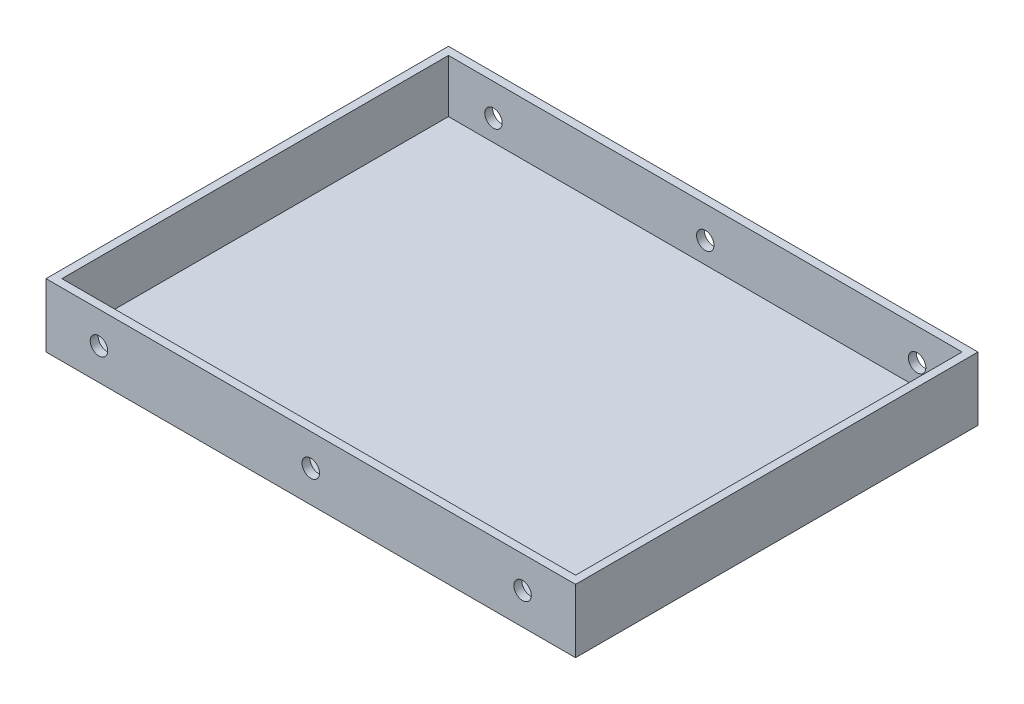
ISO-10303-21;
HEADER;
FILE_DESCRIPTION(('STEP AP214'),'2;1');
FILE_NAME('part.step','',(''),(''),'','','');
FILE_SCHEMA(('AUTOMOTIVE_DESIGN { 1 0 10303 214 1 1 1 1 }'));
ENDSEC;
DATA;
#1=APPLICATION_CONTEXT('core data for automotive mechanical design processes');
#2=APPLICATION_PROTOCOL_DEFINITION('international standard','automotive_design',2000,#1);
#3=PRODUCT_CONTEXT('',#1,'mechanical');
#4=PRODUCT('Part','Part','',(#3));
#5=PRODUCT_RELATED_PRODUCT_CATEGORY('part','',(#4));
#6=PRODUCT_DEFINITION_FORMATION('','',#4);
#7=PRODUCT_DEFINITION_CONTEXT('part definition',#1,'design');
#8=PRODUCT_DEFINITION('design','',#6,#7);
#9=PRODUCT_DEFINITION_SHAPE('','',#8);
#10=(LENGTH_UNIT() NAMED_UNIT(*) SI_UNIT(.MILLI.,.METRE.));
#11=(NAMED_UNIT(*) PLANE_ANGLE_UNIT() SI_UNIT($,.RADIAN.));
#12=(NAMED_UNIT(*) SI_UNIT($,.STERADIAN.) SOLID_ANGLE_UNIT());
#13=UNCERTAINTY_MEASURE_WITH_UNIT(LENGTH_MEASURE(1.E-05),#10,'distance_accuracy_value','');
#14=(GEOMETRIC_REPRESENTATION_CONTEXT(3) GLOBAL_UNCERTAINTY_ASSIGNED_CONTEXT((#13)) GLOBAL_UNIT_ASSIGNED_CONTEXT((#10,
#11,#12)) REPRESENTATION_CONTEXT('',''));
#15=CARTESIAN_POINT('',(0.,0.,0.));
#16=DIRECTION('',(0.,0.,1.));
#17=DIRECTION('',(1.,0.,0.));
#18=AXIS2_PLACEMENT_3D('',#15,#16,#17);
#19=CARTESIAN_POINT('',(0.,12.,0.));
#20=DIRECTION('',(1.,0.,0.));
#21=DIRECTION('',(0.,0.,-1.));
#22=AXIS2_PLACEMENT_3D('',#19,#20,#21);
#23=PLANE('',#22);
#24=DIRECTION('',(0.,0.,1.));
#25=VECTOR('',#24,1.);
#26=CARTESIAN_POINT('',(0.,0.,0.));
#27=LINE('',#26,#25);
#28=CARTESIAN_POINT('',(0.,0.,-76.));
#29=VERTEX_POINT('',#28);
#30=CARTESIAN_POINT('',(0.,0.,0.));
#31=VERTEX_POINT('',#30);
#32=EDGE_CURVE('E150',#29,#31,#27,.T.);
#33=ORIENTED_EDGE('',*,*,#32,.T.);
#34=DIRECTION('',(0.,-1.,0.));
#35=VECTOR('',#34,1.);
#36=CARTESIAN_POINT('',(0.,12.,0.));
#37=LINE('',#36,#35);
#38=CARTESIAN_POINT('',(0.,12.,0.));
#39=VERTEX_POINT('',#38);
#40=EDGE_CURVE('E12',#39,#31,#37,.T.);
#41=ORIENTED_EDGE('',*,*,#40,.F.);
#42=DIRECTION('',(0.,0.,1.));
#43=VECTOR('',#42,1.);
#44=CARTESIAN_POINT('',(0.,12.,0.));
#45=LINE('',#44,#43);
#46=CARTESIAN_POINT('',(0.,12.,-76.));
#47=VERTEX_POINT('',#46);
#48=EDGE_CURVE('E151',#47,#39,#45,.T.);
#49=ORIENTED_EDGE('',*,*,#48,.F.);
#50=DIRECTION('',(0.,-1.,0.));
#51=VECTOR('',#50,1.);
#52=CARTESIAN_POINT('',(0.,12.,-76.));
#53=LINE('',#52,#51);
#54=EDGE_CURVE('E157',#47,#29,#53,.T.);
#55=ORIENTED_EDGE('',*,*,#54,.T.);
#56=EDGE_LOOP('',(#33,#41,#49,#55));
#57=FACE_BOUND('',#56,.T.);
#58=ADVANCED_FACE('F37',(#57),#23,.F.);
#59=CARTESIAN_POINT('',(0.,12.,0.));
#60=DIRECTION('',(0.,0.,-1.));
#61=DIRECTION('',(-1.,0.,0.));
#62=AXIS2_PLACEMENT_3D('',#59,#60,#61);
#63=PLANE('',#62);
#64=CARTESIAN_POINT('',(90.,6.,0.));
#65=DIRECTION('',(0.,0.,-1.));
#66=DIRECTION('',(-1.,0.,0.));
#67=AXIS2_PLACEMENT_3D('',#64,#65,#66);
#68=CIRCLE('',#67,1.65);
#69=CARTESIAN_POINT('',(88.35,6.,0.));
#70=VERTEX_POINT('',#69);
#71=EDGE_CURVE('E173',#70,#70,#68,.T.);
#72=ORIENTED_EDGE('',*,*,#71,.T.);
#73=EDGE_LOOP('',(#72));
#74=FACE_BOUND('',#73,.T.);
#75=CARTESIAN_POINT('',(10.,6.,0.));
#76=DIRECTION('',(0.,0.,-1.));
#77=DIRECTION('',(1.,0.,0.));
#78=AXIS2_PLACEMENT_3D('',#75,#76,#77);
#79=CIRCLE('',#78,1.65);
#80=CARTESIAN_POINT('',(11.65,6.,0.));
#81=VERTEX_POINT('',#80);
#82=EDGE_CURVE('E250',#81,#81,#79,.T.);
#83=ORIENTED_EDGE('',*,*,#82,.T.);
#84=EDGE_LOOP('',(#83));
#85=FACE_BOUND('',#84,.T.);
#86=CARTESIAN_POINT('',(50.,6.,0.));
#87=DIRECTION('',(0.,0.,-1.));
#88=DIRECTION('',(-1.,0.,0.));
#89=AXIS2_PLACEMENT_3D('',#86,#87,#88);
#90=CIRCLE('',#89,1.65);
#91=CARTESIAN_POINT('',(48.35,6.,0.));
#92=VERTEX_POINT('',#91);
#93=EDGE_CURVE('E246',#92,#92,#90,.T.);
#94=ORIENTED_EDGE('',*,*,#93,.T.);
#95=EDGE_LOOP('',(#94));
#96=FACE_BOUND('',#95,.T.);
#97=DIRECTION('',(1.,0.,0.));
#98=VECTOR('',#97,1.);
#99=CARTESIAN_POINT('',(0.,0.,0.));
#100=LINE('',#99,#98);
#101=CARTESIAN_POINT('',(100.,0.,0.));
#102=VERTEX_POINT('',#101);
#103=EDGE_CURVE('E160',#31,#102,#100,.T.);
#104=ORIENTED_EDGE('',*,*,#103,.T.);
#105=DIRECTION('',(0.,-1.,0.));
#106=VECTOR('',#105,1.);
#107=CARTESIAN_POINT('',(100.,12.,0.));
#108=LINE('',#107,#106);
#109=CARTESIAN_POINT('',(100.,12.,0.));
#110=VERTEX_POINT('',#109);
#111=EDGE_CURVE('E45',#110,#102,#108,.T.);
#112=ORIENTED_EDGE('',*,*,#111,.F.);
#113=DIRECTION('',(1.,0.,0.));
#114=VECTOR('',#113,1.);
#115=CARTESIAN_POINT('',(0.,12.,0.));
#116=LINE('',#115,#114);
#117=EDGE_CURVE('E90',#39,#110,#116,.T.);
#118=ORIENTED_EDGE('',*,*,#117,.F.);
#119=ORIENTED_EDGE('',*,*,#40,.T.);
#120=EDGE_LOOP('',(#104,#112,#118,#119));
#121=FACE_BOUND('',#120,.T.);
#122=ADVANCED_FACE('F206',(#74,#85,#96,#121),#63,.F.);
#123=CARTESIAN_POINT('',(100.,12.,0.));
#124=DIRECTION('',(-1.,0.,0.));
#125=DIRECTION('',(0.,0.,1.));
#126=AXIS2_PLACEMENT_3D('',#123,#124,#125);
#127=PLANE('',#126);
#128=DIRECTION('',(0.,0.,-1.));
#129=VECTOR('',#128,1.);
#130=CARTESIAN_POINT('',(100.,0.,0.));
#131=LINE('',#130,#129);
#132=CARTESIAN_POINT('',(100.,0.,-76.));
#133=VERTEX_POINT('',#132);
#134=EDGE_CURVE('E162',#102,#133,#131,.T.);
#135=ORIENTED_EDGE('',*,*,#134,.T.);
#136=DIRECTION('',(0.,-1.,0.));
#137=VECTOR('',#136,1.);
#138=CARTESIAN_POINT('',(100.,12.,-76.));
#139=LINE('',#138,#137);
#140=CARTESIAN_POINT('',(100.,12.,-76.));
#141=VERTEX_POINT('',#140);
#142=EDGE_CURVE('E166',#141,#133,#139,.T.);
#143=ORIENTED_EDGE('',*,*,#142,.F.);
#144=DIRECTION('',(0.,0.,-1.));
#145=VECTOR('',#144,1.);
#146=CARTESIAN_POINT('',(100.,12.,0.));
#147=LINE('',#146,#145);
#148=EDGE_CURVE('E154',#110,#141,#147,.T.);
#149=ORIENTED_EDGE('',*,*,#148,.F.);
#150=ORIENTED_EDGE('',*,*,#111,.T.);
#151=EDGE_LOOP('',(#135,#143,#149,#150));
#152=FACE_BOUND('',#151,.T.);
#153=ADVANCED_FACE('F211',(#152),#127,.F.);
#154=CARTESIAN_POINT('',(0.,12.,-76.));
#155=DIRECTION('',(0.,0.,1.));
#156=DIRECTION('',(1.,0.,0.));
#157=AXIS2_PLACEMENT_3D('',#154,#155,#156);
#158=PLANE('',#157);
#159=CARTESIAN_POINT('',(90.,6.,-76.));
#160=DIRECTION('',(0.,0.,-1.));
#161=DIRECTION('',(-1.,0.,0.));
#162=AXIS2_PLACEMENT_3D('',#159,#160,#161);
#163=CIRCLE('',#162,1.65);
#164=CARTESIAN_POINT('',(88.35,6.,-76.));
#165=VERTEX_POINT('',#164);
#166=EDGE_CURVE('E238',#165,#165,#163,.T.);
#167=ORIENTED_EDGE('',*,*,#166,.F.);
#168=EDGE_LOOP('',(#167));
#169=FACE_BOUND('',#168,.T.);
#170=CARTESIAN_POINT('',(10.,6.,-76.));
#171=DIRECTION('',(0.,0.,-1.));
#172=DIRECTION('',(1.,0.,0.));
#173=AXIS2_PLACEMENT_3D('',#170,#171,#172);
#174=CIRCLE('',#173,1.65);
#175=CARTESIAN_POINT('',(11.65,6.,-76.));
#176=VERTEX_POINT('',#175);
#177=EDGE_CURVE('E242',#176,#176,#174,.T.);
#178=ORIENTED_EDGE('',*,*,#177,.F.);
#179=EDGE_LOOP('',(#178));
#180=FACE_BOUND('',#179,.T.);
#181=CARTESIAN_POINT('',(50.,6.,-76.));
#182=DIRECTION('',(0.,0.,-1.));
#183=DIRECTION('',(-1.,0.,0.));
#184=AXIS2_PLACEMENT_3D('',#181,#182,#183);
#185=CIRCLE('',#184,1.65);
#186=CARTESIAN_POINT('',(48.35,6.,-76.));
#187=VERTEX_POINT('',#186);
#188=EDGE_CURVE('E186',#187,#187,#185,.T.);
#189=ORIENTED_EDGE('',*,*,#188,.F.);
#190=EDGE_LOOP('',(#189));
#191=FACE_BOUND('',#190,.T.);
#192=DIRECTION('',(-1.,0.,0.));
#193=VECTOR('',#192,1.);
#194=CARTESIAN_POINT('',(0.,0.,-76.));
#195=LINE('',#194,#193);
#196=EDGE_CURVE('E83',#133,#29,#195,.T.);
#197=ORIENTED_EDGE('',*,*,#196,.T.);
#198=ORIENTED_EDGE('',*,*,#54,.F.);
#199=DIRECTION('',(-1.,0.,0.));
#200=VECTOR('',#199,1.);
#201=CARTESIAN_POINT('',(0.,12.,-76.));
#202=LINE('',#201,#200);
#203=EDGE_CURVE('E62',#141,#47,#202,.T.);
#204=ORIENTED_EDGE('',*,*,#203,.F.);
#205=ORIENTED_EDGE('',*,*,#142,.T.);
#206=EDGE_LOOP('',(#197,#198,#204,#205));
#207=FACE_BOUND('',#206,.T.);
#208=ADVANCED_FACE('F200',(#169,#180,#191,#207),#158,.F.);
#209=CARTESIAN_POINT('',(0.,12.,0.));
#210=DIRECTION('',(0.,-1.,0.));
#211=DIRECTION('',(0.,0.,-1.));
#212=AXIS2_PLACEMENT_3D('',#209,#210,#211);
#213=PLANE('',#212);
#214=DIRECTION('',(1.,0.,0.));
#215=VECTOR('',#214,1.);
#216=CARTESIAN_POINT('',(1.5,12.,-1.5));
#217=LINE('',#216,#215);
#218=CARTESIAN_POINT('',(1.5,12.,-1.5));
#219=VERTEX_POINT('',#218);
#220=CARTESIAN_POINT('',(98.5,12.,-1.5));
#221=VERTEX_POINT('',#220);
#222=EDGE_CURVE('E136',#219,#221,#217,.T.);
#223=ORIENTED_EDGE('',*,*,#222,.F.);
#224=DIRECTION('',(0.,0.,1.));
#225=VECTOR('',#224,1.);
#226=CARTESIAN_POINT('',(1.5,12.,-74.5));
#227=LINE('',#226,#225);
#228=CARTESIAN_POINT('',(1.5,12.,-74.5));
#229=VERTEX_POINT('',#228);
#230=EDGE_CURVE('E129',#229,#219,#227,.T.);
#231=ORIENTED_EDGE('',*,*,#230,.F.);
#232=DIRECTION('',(-1.,0.,0.));
#233=VECTOR('',#232,1.);
#234=CARTESIAN_POINT('',(98.5,12.,-74.5));
#235=LINE('',#234,#233);
#236=CARTESIAN_POINT('',(98.5,12.,-74.5));
#237=VERTEX_POINT('',#236);
#238=EDGE_CURVE('E140',#237,#229,#235,.T.);
#239=ORIENTED_EDGE('',*,*,#238,.F.);
#240=DIRECTION('',(0.,0.,-1.));
#241=VECTOR('',#240,1.);
#242=CARTESIAN_POINT('',(98.5,12.,-1.5));
#243=LINE('',#242,#241);
#244=EDGE_CURVE('E53',#221,#237,#243,.T.);
#245=ORIENTED_EDGE('',*,*,#244,.F.);
#246=EDGE_LOOP('',(#223,#231,#239,#245));
#247=FACE_BOUND('',#246,.T.);
#248=ORIENTED_EDGE('',*,*,#48,.T.);
#249=ORIENTED_EDGE('',*,*,#117,.T.);
#250=ORIENTED_EDGE('',*,*,#148,.T.);
#251=ORIENTED_EDGE('',*,*,#203,.T.);
#252=EDGE_LOOP('',(#248,#249,#250,#251));
#253=FACE_BOUND('',#252,.T.);
#254=ADVANCED_FACE('F197',(#247,#253),#213,.F.);
#255=CARTESIAN_POINT('',(0.,0.,0.));
#256=DIRECTION('',(0.,-1.,0.));
#257=DIRECTION('',(0.,0.,-1.));
#258=AXIS2_PLACEMENT_3D('',#255,#256,#257);
#259=PLANE('',#258);
#260=ORIENTED_EDGE('',*,*,#32,.F.);
#261=ORIENTED_EDGE('',*,*,#196,.F.);
#262=ORIENTED_EDGE('',*,*,#134,.F.);
#263=ORIENTED_EDGE('',*,*,#103,.F.);
#264=EDGE_LOOP('',(#260,#261,#262,#263));
#265=FACE_BOUND('',#264,.T.);
#266=ADVANCED_FACE('F199',(#265),#259,.T.);
#267=CARTESIAN_POINT('',(0.,2.,0.));
#268=DIRECTION('',(0.,-1.,0.));
#269=DIRECTION('',(0.,0.,-1.));
#270=AXIS2_PLACEMENT_3D('',#267,#268,#269);
#271=PLANE('',#270);
#272=DIRECTION('',(-1.,0.,0.));
#273=VECTOR('',#272,1.);
#274=CARTESIAN_POINT('',(98.5,2.,-74.5));
#275=LINE('',#274,#273);
#276=CARTESIAN_POINT('',(98.5,2.,-74.5));
#277=VERTEX_POINT('',#276);
#278=CARTESIAN_POINT('',(1.5,2.,-74.5));
#279=VERTEX_POINT('',#278);
#280=EDGE_CURVE('E133',#277,#279,#275,.T.);
#281=ORIENTED_EDGE('',*,*,#280,.T.);
#282=DIRECTION('',(0.,0.,1.));
#283=VECTOR('',#282,1.);
#284=CARTESIAN_POINT('',(1.5,2.,-74.5));
#285=LINE('',#284,#283);
#286=CARTESIAN_POINT('',(1.5,2.,-1.5));
#287=VERTEX_POINT('',#286);
#288=EDGE_CURVE('E126',#279,#287,#285,.T.);
#289=ORIENTED_EDGE('',*,*,#288,.T.);
#290=DIRECTION('',(1.,0.,0.));
#291=VECTOR('',#290,1.);
#292=CARTESIAN_POINT('',(1.5,2.,-1.5));
#293=LINE('',#292,#291);
#294=CARTESIAN_POINT('',(98.5,2.,-1.5));
#295=VERTEX_POINT('',#294);
#296=EDGE_CURVE('E113',#287,#295,#293,.T.);
#297=ORIENTED_EDGE('',*,*,#296,.T.);
#298=DIRECTION('',(0.,0.,-1.));
#299=VECTOR('',#298,1.);
#300=CARTESIAN_POINT('',(98.5,2.,-1.5));
#301=LINE('',#300,#299);
#302=EDGE_CURVE('E145',#295,#277,#301,.T.);
#303=ORIENTED_EDGE('',*,*,#302,.T.);
#304=EDGE_LOOP('',(#281,#289,#297,#303));
#305=FACE_BOUND('',#304,.T.);
#306=ADVANCED_FACE('F132',(#305),#271,.F.);
#307=CARTESIAN_POINT('',(1.5,-121.400164744534,-74.5));
#308=DIRECTION('',(-1.,0.,0.));
#309=DIRECTION('',(0.,0.,1.));
#310=AXIS2_PLACEMENT_3D('',#307,#308,#309);
#311=PLANE('',#310);
#312=DIRECTION('',(0.,1.,0.));
#313=VECTOR('',#312,1.);
#314=CARTESIAN_POINT('',(1.5,-121.400164744534,-74.5));
#315=LINE('',#314,#313);
#316=EDGE_CURVE('E143',#279,#229,#315,.T.);
#317=ORIENTED_EDGE('',*,*,#316,.T.);
#318=ORIENTED_EDGE('',*,*,#230,.T.);
#319=DIRECTION('',(0.,1.,0.));
#320=VECTOR('',#319,1.);
#321=CARTESIAN_POINT('',(1.5,-121.400164744534,-1.5));
#322=LINE('',#321,#320);
#323=EDGE_CURVE('E117',#287,#219,#322,.T.);
#324=ORIENTED_EDGE('',*,*,#323,.F.);
#325=ORIENTED_EDGE('',*,*,#288,.F.);
#326=EDGE_LOOP('',(#317,#318,#324,#325));
#327=FACE_BOUND('',#326,.T.);
#328=ADVANCED_FACE('F125',(#327),#311,.F.);
#329=CARTESIAN_POINT('',(1.5,-121.400164744534,-1.5));
#330=DIRECTION('',(0.,0.,1.));
#331=DIRECTION('',(1.,0.,0.));
#332=AXIS2_PLACEMENT_3D('',#329,#330,#331);
#333=PLANE('',#332);
#334=CARTESIAN_POINT('',(90.,6.,-1.5));
#335=DIRECTION('',(0.,0.,1.));
#336=DIRECTION('',(1.,0.,0.));
#337=AXIS2_PLACEMENT_3D('',#334,#335,#336);
#338=CIRCLE('',#337,1.65);
#339=CARTESIAN_POINT('',(91.65,6.,-1.5));
#340=VERTEX_POINT('',#339);
#341=EDGE_CURVE('E189',#340,#340,#338,.T.);
#342=ORIENTED_EDGE('',*,*,#341,.T.);
#343=EDGE_LOOP('',(#342));
#344=FACE_BOUND('',#343,.T.);
#345=CARTESIAN_POINT('',(10.,6.,-1.5));
#346=DIRECTION('',(0.,0.,1.));
#347=DIRECTION('',(1.,0.,0.));
#348=AXIS2_PLACEMENT_3D('',#345,#346,#347);
#349=CIRCLE('',#348,1.65);
#350=CARTESIAN_POINT('',(11.65,6.,-1.5));
#351=VERTEX_POINT('',#350);
#352=EDGE_CURVE('E176',#351,#351,#349,.T.);
#353=ORIENTED_EDGE('',*,*,#352,.T.);
#354=EDGE_LOOP('',(#353));
#355=FACE_BOUND('',#354,.T.);
#356=CARTESIAN_POINT('',(50.,6.,-1.5));
#357=DIRECTION('',(0.,0.,1.));
#358=DIRECTION('',(1.,0.,0.));
#359=AXIS2_PLACEMENT_3D('',#356,#357,#358);
#360=CIRCLE('',#359,1.65);
#361=CARTESIAN_POINT('',(51.65,6.,-1.5));
#362=VERTEX_POINT('',#361);
#363=EDGE_CURVE('E172',#362,#362,#360,.T.);
#364=ORIENTED_EDGE('',*,*,#363,.T.);
#365=EDGE_LOOP('',(#364));
#366=FACE_BOUND('',#365,.T.);
#367=ORIENTED_EDGE('',*,*,#323,.T.);
#368=ORIENTED_EDGE('',*,*,#222,.T.);
#369=DIRECTION('',(0.,1.,0.));
#370=VECTOR('',#369,1.);
#371=CARTESIAN_POINT('',(98.5,-121.400164744534,-1.5));
#372=LINE('',#371,#370);
#373=EDGE_CURVE('E119',#295,#221,#372,.T.);
#374=ORIENTED_EDGE('',*,*,#373,.F.);
#375=ORIENTED_EDGE('',*,*,#296,.F.);
#376=EDGE_LOOP('',(#367,#368,#374,#375));
#377=FACE_BOUND('',#376,.T.);
#378=ADVANCED_FACE('F115',(#344,#355,#366,#377),#333,.F.);
#379=CARTESIAN_POINT('',(98.5,-121.400164744534,-1.5));
#380=DIRECTION('',(1.,0.,0.));
#381=DIRECTION('',(0.,0.,-1.));
#382=AXIS2_PLACEMENT_3D('',#379,#380,#381);
#383=PLANE('',#382);
#384=ORIENTED_EDGE('',*,*,#373,.T.);
#385=ORIENTED_EDGE('',*,*,#244,.T.);
#386=DIRECTION('',(0.,1.,0.));
#387=VECTOR('',#386,1.);
#388=CARTESIAN_POINT('',(98.5,-121.400164744534,-74.5));
#389=LINE('',#388,#387);
#390=EDGE_CURVE('E144',#277,#237,#389,.T.);
#391=ORIENTED_EDGE('',*,*,#390,.F.);
#392=ORIENTED_EDGE('',*,*,#302,.F.);
#393=EDGE_LOOP('',(#384,#385,#391,#392));
#394=FACE_BOUND('',#393,.T.);
#395=ADVANCED_FACE('F268',(#394),#383,.F.);
#396=CARTESIAN_POINT('',(98.5,-121.400164744534,-74.5));
#397=DIRECTION('',(0.,0.,-1.));
#398=DIRECTION('',(-1.,0.,0.));
#399=AXIS2_PLACEMENT_3D('',#396,#397,#398);
#400=PLANE('',#399);
#401=CARTESIAN_POINT('',(90.,6.,-74.5));
#402=DIRECTION('',(0.,0.,-1.));
#403=DIRECTION('',(-1.,0.,0.));
#404=AXIS2_PLACEMENT_3D('',#401,#402,#403);
#405=CIRCLE('',#404,1.65);
#406=CARTESIAN_POINT('',(88.35,6.,-74.5));
#407=VERTEX_POINT('',#406);
#408=EDGE_CURVE('E40',#407,#407,#405,.T.);
#409=ORIENTED_EDGE('',*,*,#408,.T.);
#410=EDGE_LOOP('',(#409));
#411=FACE_BOUND('',#410,.T.);
#412=CARTESIAN_POINT('',(10.,6.,-74.5));
#413=DIRECTION('',(0.,0.,-1.));
#414=DIRECTION('',(-1.,0.,0.));
#415=AXIS2_PLACEMENT_3D('',#412,#413,#414);
#416=CIRCLE('',#415,1.65);
#417=CARTESIAN_POINT('',(8.35000000000001,6.,-74.5));
#418=VERTEX_POINT('',#417);
#419=EDGE_CURVE('E174',#418,#418,#416,.T.);
#420=ORIENTED_EDGE('',*,*,#419,.T.);
#421=EDGE_LOOP('',(#420));
#422=FACE_BOUND('',#421,.T.);
#423=CARTESIAN_POINT('',(50.,6.,-74.5));
#424=DIRECTION('',(0.,0.,-1.));
#425=DIRECTION('',(-1.,0.,0.));
#426=AXIS2_PLACEMENT_3D('',#423,#424,#425);
#427=CIRCLE('',#426,1.65);
#428=CARTESIAN_POINT('',(48.35,6.,-74.5));
#429=VERTEX_POINT('',#428);
#430=EDGE_CURVE('E170',#429,#429,#427,.T.);
#431=ORIENTED_EDGE('',*,*,#430,.T.);
#432=EDGE_LOOP('',(#431));
#433=FACE_BOUND('',#432,.T.);
#434=ORIENTED_EDGE('',*,*,#390,.T.);
#435=ORIENTED_EDGE('',*,*,#238,.T.);
#436=ORIENTED_EDGE('',*,*,#316,.F.);
#437=ORIENTED_EDGE('',*,*,#280,.F.);
#438=EDGE_LOOP('',(#434,#435,#436,#437));
#439=FACE_BOUND('',#438,.T.);
#440=ADVANCED_FACE('F195',(#411,#422,#433,#439),#400,.F.);
#441=CARTESIAN_POINT('',(50.,6.,0.));
#442=DIRECTION('',(0.,0.,-1.));
#443=DIRECTION('',(-1.,0.,0.));
#444=AXIS2_PLACEMENT_3D('',#441,#442,#443);
#445=CYLINDRICAL_SURFACE('',#444,1.65);
#446=ORIENTED_EDGE('',*,*,#188,.T.);
#447=EDGE_LOOP('',(#446));
#448=FACE_BOUND('',#447,.T.);
#449=ORIENTED_EDGE('',*,*,#430,.F.);
#450=EDGE_LOOP('',(#449));
#451=FACE_BOUND('',#450,.T.);
#452=ADVANCED_FACE('F282',(#448,#451),#445,.F.);
#453=CARTESIAN_POINT('',(10.,6.,0.));
#454=DIRECTION('',(0.,0.,-1.));
#455=DIRECTION('',(-1.,0.,0.));
#456=AXIS2_PLACEMENT_3D('',#453,#454,#455);
#457=CYLINDRICAL_SURFACE('',#456,1.65);
#458=ORIENTED_EDGE('',*,*,#177,.T.);
#459=EDGE_LOOP('',(#458));
#460=FACE_BOUND('',#459,.T.);
#461=ORIENTED_EDGE('',*,*,#419,.F.);
#462=EDGE_LOOP('',(#461));
#463=FACE_BOUND('',#462,.T.);
#464=ADVANCED_FACE('F276',(#460,#463),#457,.F.);
#465=CARTESIAN_POINT('',(90.,6.,0.));
#466=DIRECTION('',(0.,0.,-1.));
#467=DIRECTION('',(-1.,0.,0.));
#468=AXIS2_PLACEMENT_3D('',#465,#466,#467);
#469=CYLINDRICAL_SURFACE('',#468,1.65);
#470=ORIENTED_EDGE('',*,*,#166,.T.);
#471=EDGE_LOOP('',(#470));
#472=FACE_BOUND('',#471,.T.);
#473=ORIENTED_EDGE('',*,*,#408,.F.);
#474=EDGE_LOOP('',(#473));
#475=FACE_BOUND('',#474,.T.);
#476=ADVANCED_FACE('F263',(#472,#475),#469,.F.);
#477=ORIENTED_EDGE('',*,*,#93,.F.);
#478=EDGE_LOOP('',(#477));
#479=FACE_BOUND('',#478,.T.);
#480=ORIENTED_EDGE('',*,*,#363,.F.);
#481=EDGE_LOOP('',(#480));
#482=FACE_BOUND('',#481,.T.);
#483=ADVANCED_FACE('F273',(#479,#482),#445,.F.);
#484=ORIENTED_EDGE('',*,*,#82,.F.);
#485=EDGE_LOOP('',(#484));
#486=FACE_BOUND('',#485,.T.);
#487=ORIENTED_EDGE('',*,*,#352,.F.);
#488=EDGE_LOOP('',(#487));
#489=FACE_BOUND('',#488,.T.);
#490=ADVANCED_FACE('F261',(#486,#489),#457,.F.);
#491=ORIENTED_EDGE('',*,*,#71,.F.);
#492=EDGE_LOOP('',(#491));
#493=FACE_BOUND('',#492,.T.);
#494=ORIENTED_EDGE('',*,*,#341,.F.);
#495=EDGE_LOOP('',(#494));
#496=FACE_BOUND('',#495,.T.);
#497=ADVANCED_FACE('F258',(#493,#496),#469,.F.);
#498=CLOSED_SHELL('',(#58,#122,#153,#208,#254,#266,#306,#328,#378,#395,#440,#452,#464,#476,#483,
#490,#497));
#499=MANIFOLD_SOLID_BREP('B2',#498);
#500=ADVANCED_BREP_SHAPE_REPRESENTATION('',(#18,#499),#14);
#501=SHAPE_DEFINITION_REPRESENTATION(#9,#500);
ENDSEC;
END-ISO-10303-21;
